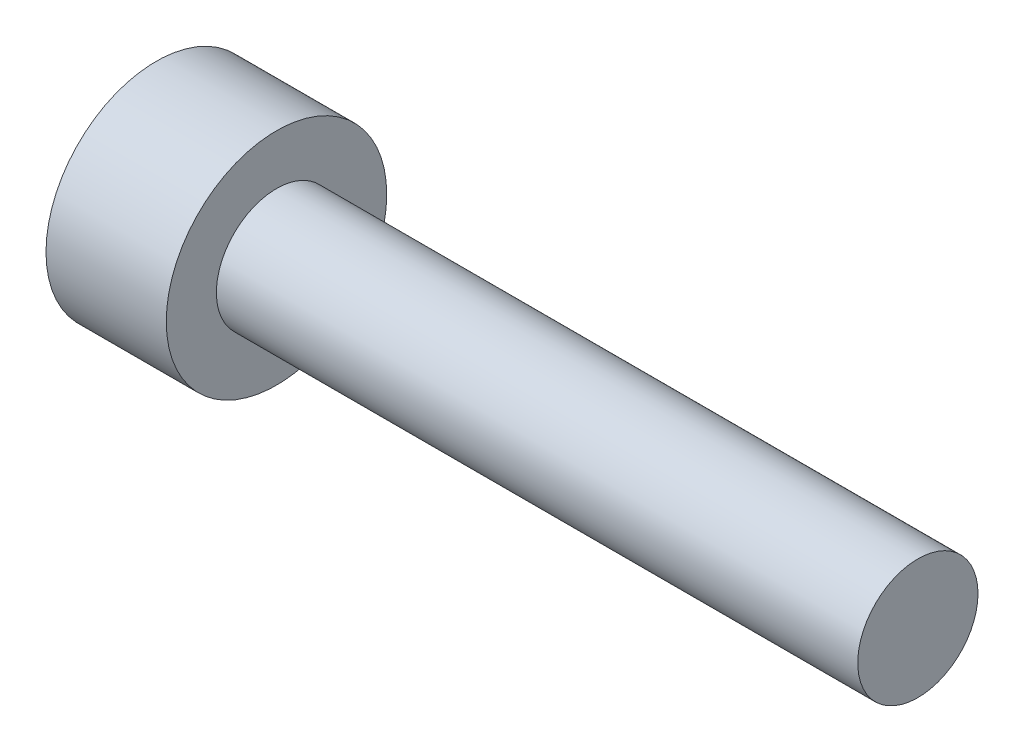
ISO-10303-21;
HEADER;
FILE_DESCRIPTION(('STEP AP214'),'2;1');
FILE_NAME('part.step','',(''),(''),'','','');
FILE_SCHEMA(('AUTOMOTIVE_DESIGN { 1 0 10303 214 1 1 1 1 }'));
ENDSEC;
DATA;
#1=APPLICATION_CONTEXT('core data for automotive mechanical design processes');
#2=APPLICATION_PROTOCOL_DEFINITION('international standard','automotive_design',2000,#1);
#3=PRODUCT_CONTEXT('',#1,'mechanical');
#4=PRODUCT('Part','Part','',(#3));
#5=PRODUCT_RELATED_PRODUCT_CATEGORY('part','',(#4));
#6=PRODUCT_DEFINITION_FORMATION('','',#4);
#7=PRODUCT_DEFINITION_CONTEXT('part definition',#1,'design');
#8=PRODUCT_DEFINITION('design','',#6,#7);
#9=PRODUCT_DEFINITION_SHAPE('','',#8);
#10=(LENGTH_UNIT() NAMED_UNIT(*) SI_UNIT(.MILLI.,.METRE.));
#11=(NAMED_UNIT(*) PLANE_ANGLE_UNIT() SI_UNIT($,.RADIAN.));
#12=(NAMED_UNIT(*) SI_UNIT($,.STERADIAN.) SOLID_ANGLE_UNIT());
#13=UNCERTAINTY_MEASURE_WITH_UNIT(LENGTH_MEASURE(1.E-05),#10,'distance_accuracy_value','');
#14=(GEOMETRIC_REPRESENTATION_CONTEXT(3) GLOBAL_UNCERTAINTY_ASSIGNED_CONTEXT((#13)) GLOBAL_UNIT_ASSIGNED_CONTEXT((#10,
#11,#12)) REPRESENTATION_CONTEXT('',''));
#15=CARTESIAN_POINT('',(0.,0.,0.));
#16=DIRECTION('',(0.,0.,1.));
#17=DIRECTION('',(1.,0.,0.));
#18=AXIS2_PLACEMENT_3D('',#15,#16,#17);
#19=CARTESIAN_POINT('',(3.,0.,0.));
#20=DIRECTION('',(-1.,0.,0.));
#21=DIRECTION('',(0.,0.,1.));
#22=AXIS2_PLACEMENT_3D('',#19,#20,#21);
#23=CYLINDRICAL_SURFACE('',#22,2.75);
#24=CARTESIAN_POINT('',(3.,0.,0.));
#25=DIRECTION('',(1.,0.,0.));
#26=DIRECTION('',(0.,0.,-1.));
#27=AXIS2_PLACEMENT_3D('',#24,#25,#26);
#28=CIRCLE('',#27,2.75);
#29=CARTESIAN_POINT('',(3.,0.,-2.75));
#30=VERTEX_POINT('',#29);
#31=EDGE_CURVE('E42',#30,#30,#28,.T.);
#32=ORIENTED_EDGE('',*,*,#31,.F.);
#33=EDGE_LOOP('',(#32));
#34=FACE_BOUND('',#33,.T.);
#35=CARTESIAN_POINT('',(0.,0.,0.));
#36=DIRECTION('',(1.,0.,0.));
#37=DIRECTION('',(0.,0.,-1.));
#38=AXIS2_PLACEMENT_3D('',#35,#36,#37);
#39=CIRCLE('',#38,2.75);
#40=CARTESIAN_POINT('',(0.,0.,-2.75));
#41=VERTEX_POINT('',#40);
#42=EDGE_CURVE('E37',#41,#41,#39,.T.);
#43=ORIENTED_EDGE('',*,*,#42,.T.);
#44=EDGE_LOOP('',(#43));
#45=FACE_BOUND('',#44,.T.);
#46=ADVANCED_FACE('F40',(#34,#45),#23,.T.);
#47=CARTESIAN_POINT('',(3.,0.,0.));
#48=DIRECTION('',(1.,0.,0.));
#49=DIRECTION('',(0.,0.,-1.));
#50=AXIS2_PLACEMENT_3D('',#47,#48,#49);
#51=PLANE('',#50);
#52=CARTESIAN_POINT('',(3.,0.,0.));
#53=DIRECTION('',(1.,0.,0.));
#54=DIRECTION('',(0.,0.,-1.));
#55=AXIS2_PLACEMENT_3D('',#52,#53,#54);
#56=CIRCLE('',#55,1.5);
#57=CARTESIAN_POINT('',(3.,0.,-1.5));
#58=VERTEX_POINT('',#57);
#59=EDGE_CURVE('E10',#58,#58,#56,.T.);
#60=ORIENTED_EDGE('',*,*,#59,.F.);
#61=EDGE_LOOP('',(#60));
#62=FACE_BOUND('',#61,.T.);
#63=ORIENTED_EDGE('',*,*,#31,.T.);
#64=EDGE_LOOP('',(#63));
#65=FACE_BOUND('',#64,.T.);
#66=ADVANCED_FACE('F62',(#62,#65),#51,.T.);
#67=CARTESIAN_POINT('',(0.,0.,0.));
#68=DIRECTION('',(1.,0.,0.));
#69=DIRECTION('',(0.,0.,-1.));
#70=AXIS2_PLACEMENT_3D('',#67,#68,#69);
#71=PLANE('',#70);
#72=ORIENTED_EDGE('',*,*,#42,.F.);
#73=EDGE_LOOP('',(#72));
#74=FACE_BOUND('',#73,.T.);
#75=ADVANCED_FACE('F59',(#74),#71,.F.);
#76=CARTESIAN_POINT('',(19.,0.,0.));
#77=DIRECTION('',(-1.,0.,0.));
#78=DIRECTION('',(0.,0.,1.));
#79=AXIS2_PLACEMENT_3D('',#76,#77,#78);
#80=CYLINDRICAL_SURFACE('',#79,1.5);
#81=CARTESIAN_POINT('',(19.,0.,0.));
#82=DIRECTION('',(1.,0.,0.));
#83=DIRECTION('',(0.,0.,-1.));
#84=AXIS2_PLACEMENT_3D('',#81,#82,#83);
#85=CIRCLE('',#84,1.5);
#86=CARTESIAN_POINT('',(19.,0.,-1.5));
#87=VERTEX_POINT('',#86);
#88=EDGE_CURVE('E49',#87,#87,#85,.T.);
#89=ORIENTED_EDGE('',*,*,#88,.F.);
#90=EDGE_LOOP('',(#89));
#91=FACE_BOUND('',#90,.T.);
#92=ORIENTED_EDGE('',*,*,#59,.T.);
#93=EDGE_LOOP('',(#92));
#94=FACE_BOUND('',#93,.T.);
#95=ADVANCED_FACE('F58',(#91,#94),#80,.T.);
#96=CARTESIAN_POINT('',(19.,0.,0.));
#97=DIRECTION('',(1.,0.,0.));
#98=DIRECTION('',(0.,0.,-1.));
#99=AXIS2_PLACEMENT_3D('',#96,#97,#98);
#100=PLANE('',#99);
#101=ORIENTED_EDGE('',*,*,#88,.T.);
#102=EDGE_LOOP('',(#101));
#103=FACE_BOUND('',#102,.T.);
#104=ADVANCED_FACE('F70',(#103),#100,.T.);
#105=CLOSED_SHELL('',(#46,#66,#75,#95,#104));
#106=MANIFOLD_SOLID_BREP('B2',#105);
#107=ADVANCED_BREP_SHAPE_REPRESENTATION('',(#18,#106),#14);
#108=SHAPE_DEFINITION_REPRESENTATION(#9,#107);
ENDSEC;
END-ISO-10303-21;
